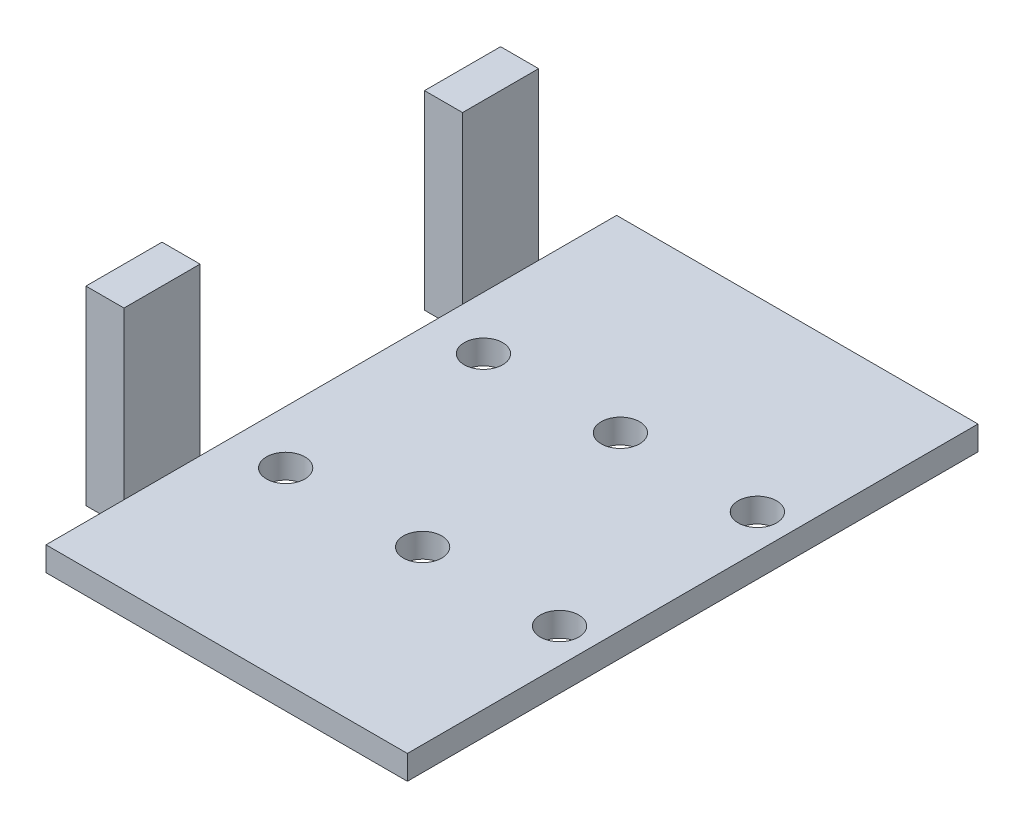
ISO-10303-21;
HEADER;
FILE_DESCRIPTION(('STEP AP214'),'2;1');
FILE_NAME('part.step','',(''),(''),'','','');
FILE_SCHEMA(('AUTOMOTIVE_DESIGN { 1 0 10303 214 1 1 1 1 }'));
ENDSEC;
DATA;
#1=APPLICATION_CONTEXT('core data for automotive mechanical design processes');
#2=APPLICATION_PROTOCOL_DEFINITION('international standard','automotive_design',2000,#1);
#3=PRODUCT_CONTEXT('',#1,'mechanical');
#4=PRODUCT('Part','Part','',(#3));
#5=PRODUCT_RELATED_PRODUCT_CATEGORY('part','',(#4));
#6=PRODUCT_DEFINITION_FORMATION('','',#4);
#7=PRODUCT_DEFINITION_CONTEXT('part definition',#1,'design');
#8=PRODUCT_DEFINITION('design','',#6,#7);
#9=PRODUCT_DEFINITION_SHAPE('','',#8);
#10=(LENGTH_UNIT() NAMED_UNIT(*) SI_UNIT(.MILLI.,.METRE.));
#11=(NAMED_UNIT(*) PLANE_ANGLE_UNIT() SI_UNIT($,.RADIAN.));
#12=(NAMED_UNIT(*) SI_UNIT($,.STERADIAN.) SOLID_ANGLE_UNIT());
#13=UNCERTAINTY_MEASURE_WITH_UNIT(LENGTH_MEASURE(1.E-05),#10,'distance_accuracy_value','');
#14=(GEOMETRIC_REPRESENTATION_CONTEXT(3) GLOBAL_UNCERTAINTY_ASSIGNED_CONTEXT((#13)) GLOBAL_UNIT_ASSIGNED_CONTEXT((#10,
#11,#12)) REPRESENTATION_CONTEXT('',''));
#15=CARTESIAN_POINT('',(0.,0.,0.));
#16=DIRECTION('',(0.,0.,1.));
#17=DIRECTION('',(1.,0.,0.));
#18=AXIS2_PLACEMENT_3D('',#15,#16,#17);
#19=CARTESIAN_POINT('',(-50.,6.35,67.7));
#20=DIRECTION('',(1.,0.,0.));
#21=DIRECTION('',(0.,0.,-1.));
#22=AXIS2_PLACEMENT_3D('',#19,#20,#21);
#23=PLANE('',#22);
#24=DIRECTION('',(0.,-1.,0.));
#25=VECTOR('',#24,1.);
#26=CARTESIAN_POINT('',(-50.,6.35,34.5));
#27=LINE('',#26,#25);
#28=CARTESIAN_POINT('',(-49.9999999999998,6.35,34.5));
#29=VERTEX_POINT('',#28);
#30=CARTESIAN_POINT('',(-50.,0.,34.5));
#31=VERTEX_POINT('',#30);
#32=EDGE_CURVE('E11',#29,#31,#27,.T.);
#33=ORIENTED_EDGE('',*,*,#32,.F.);
#34=DIRECTION('',(0.,0.,1.));
#35=VECTOR('',#34,1.);
#36=CARTESIAN_POINT('',(-50.,6.35,-75.));
#37=LINE('',#36,#35);
#38=CARTESIAN_POINT('',(-50.,6.35,-34.5));
#39=VERTEX_POINT('',#38);
#40=EDGE_CURVE('E271',#39,#29,#37,.T.);
#41=ORIENTED_EDGE('',*,*,#40,.F.);
#42=DIRECTION('',(0.,-1.,0.));
#43=VECTOR('',#42,1.);
#44=CARTESIAN_POINT('',(-50.,50.,-34.5));
#45=LINE('',#44,#43);
#46=CARTESIAN_POINT('',(-50.,0.,-34.5));
#47=VERTEX_POINT('',#46);
#48=EDGE_CURVE('E183',#39,#47,#45,.T.);
#49=ORIENTED_EDGE('',*,*,#48,.T.);
#50=DIRECTION('',(0.,0.,1.));
#51=VECTOR('',#50,1.);
#52=CARTESIAN_POINT('',(-50.,0.,67.7));
#53=LINE('',#52,#51);
#54=EDGE_CURVE('E48',#47,#31,#53,.T.);
#55=ORIENTED_EDGE('',*,*,#54,.T.);
#56=EDGE_LOOP('',(#33,#41,#49,#55));
#57=FACE_BOUND('',#56,.T.);
#58=ADVANCED_FACE('F33',(#57),#23,.F.);
#59=DIRECTION('',(0.,1.,0.));
#60=VECTOR('',#59,1.);
#61=CARTESIAN_POINT('',(-50.,6.35,54.5));
#62=LINE('',#61,#60);
#63=CARTESIAN_POINT('',(-50.,0.,54.5));
#64=VERTEX_POINT('',#63);
#65=CARTESIAN_POINT('',(-49.9999999999998,6.35,54.5));
#66=VERTEX_POINT('',#65);
#67=EDGE_CURVE('E41',#64,#66,#62,.T.);
#68=ORIENTED_EDGE('',*,*,#67,.F.);
#69=CARTESIAN_POINT('',(-50.,0.,75.));
#70=VERTEX_POINT('',#69);
#71=EDGE_CURVE('E248',#64,#70,#53,.T.);
#72=ORIENTED_EDGE('',*,*,#71,.T.);
#73=DIRECTION('',(0.,-1.,0.));
#74=VECTOR('',#73,1.);
#75=CARTESIAN_POINT('',(-50.,6.35,75.));
#76=LINE('',#75,#74);
#77=CARTESIAN_POINT('',(-50.,6.35,75.));
#78=VERTEX_POINT('',#77);
#79=EDGE_CURVE('E255',#78,#70,#76,.T.);
#80=ORIENTED_EDGE('',*,*,#79,.F.);
#81=EDGE_CURVE('E55',#66,#78,#37,.T.);
#82=ORIENTED_EDGE('',*,*,#81,.F.);
#83=EDGE_LOOP('',(#68,#72,#80,#82));
#84=FACE_BOUND('',#83,.T.);
#85=ADVANCED_FACE('F284',(#84),#23,.F.);
#86=DIRECTION('',(0.,-1.,0.));
#87=VECTOR('',#86,1.);
#88=CARTESIAN_POINT('',(-50.,50.,-54.5));
#89=LINE('',#88,#87);
#90=CARTESIAN_POINT('',(-50.,6.35,-54.5));
#91=VERTEX_POINT('',#90);
#92=CARTESIAN_POINT('',(-50.,0.,-54.5));
#93=VERTEX_POINT('',#92);
#94=EDGE_CURVE('E193',#91,#93,#89,.T.);
#95=ORIENTED_EDGE('',*,*,#94,.F.);
#96=CARTESIAN_POINT('',(-50.,6.35,-75.));
#97=VERTEX_POINT('',#96);
#98=EDGE_CURVE('E236',#97,#91,#37,.T.);
#99=ORIENTED_EDGE('',*,*,#98,.F.);
#100=DIRECTION('',(0.,-1.,0.));
#101=VECTOR('',#100,1.);
#102=CARTESIAN_POINT('',(-50.,6.35,-75.));
#103=LINE('',#102,#101);
#104=CARTESIAN_POINT('',(-50.,0.,-75.));
#105=VERTEX_POINT('',#104);
#106=EDGE_CURVE('E258',#97,#105,#103,.T.);
#107=ORIENTED_EDGE('',*,*,#106,.T.);
#108=EDGE_CURVE('E249',#105,#93,#53,.T.);
#109=ORIENTED_EDGE('',*,*,#108,.T.);
#110=EDGE_LOOP('',(#95,#99,#107,#109));
#111=FACE_BOUND('',#110,.T.);
#112=ADVANCED_FACE('F306',(#111),#23,.F.);
#113=CARTESIAN_POINT('',(0.,6.35,0.));
#114=DIRECTION('',(0.,-1.,0.));
#115=DIRECTION('',(0.,0.,-1.));
#116=AXIS2_PLACEMENT_3D('',#113,#114,#115);
#117=PLANE('',#116);
#118=DIRECTION('',(0.,0.,-1.));
#119=VECTOR('',#118,1.);
#120=CARTESIAN_POINT('',(45.,6.35,-75.));
#121=LINE('',#120,#119);
#122=CARTESIAN_POINT('',(45.,6.35,75.));
#123=VERTEX_POINT('',#122);
#124=CARTESIAN_POINT('',(45.,6.35,-75.));
#125=VERTEX_POINT('',#124);
#126=EDGE_CURVE('E230',#123,#125,#121,.T.);
#127=ORIENTED_EDGE('',*,*,#126,.T.);
#128=DIRECTION('',(-1.,0.,0.));
#129=VECTOR('',#128,1.);
#130=CARTESIAN_POINT('',(45.,6.35,-75.));
#131=LINE('',#130,#129);
#132=EDGE_CURVE('E233',#125,#97,#131,.T.);
#133=ORIENTED_EDGE('',*,*,#132,.T.);
#134=ORIENTED_EDGE('',*,*,#98,.T.);
#135=EDGE_CURVE('E240',#91,#39,#37,.T.);
#136=ORIENTED_EDGE('',*,*,#135,.T.);
#137=ORIENTED_EDGE('',*,*,#40,.T.);
#138=EDGE_CURVE('E158',#29,#66,#37,.T.);
#139=ORIENTED_EDGE('',*,*,#138,.T.);
#140=ORIENTED_EDGE('',*,*,#81,.T.);
#141=DIRECTION('',(1.,0.,0.));
#142=VECTOR('',#141,1.);
#143=CARTESIAN_POINT('',(45.,6.35,75.));
#144=LINE('',#143,#142);
#145=EDGE_CURVE('E239',#78,#123,#144,.T.);
#146=ORIENTED_EDGE('',*,*,#145,.T.);
#147=EDGE_LOOP('',(#127,#133,#134,#136,#137,#139,#140,#146));
#148=FACE_BOUND('',#147,.T.);
#149=CARTESIAN_POINT('',(-36.,6.35,-26.));
#150=DIRECTION('',(0.,1.,0.));
#151=DIRECTION('',(0.,0.,1.));
#152=AXIS2_PLACEMENT_3D('',#149,#150,#151);
#153=CIRCLE('',#152,5.05);
#154=CARTESIAN_POINT('',(-36.,6.35,-20.95));
#155=VERTEX_POINT('',#154);
#156=EDGE_CURVE('E224',#155,#155,#153,.T.);
#157=ORIENTED_EDGE('',*,*,#156,.F.);
#158=EDGE_LOOP('',(#157));
#159=FACE_BOUND('',#158,.T.);
#160=CARTESIAN_POINT('',(36.,6.35,-26.));
#161=DIRECTION('',(0.,1.,0.));
#162=DIRECTION('',(0.,0.,1.));
#163=AXIS2_PLACEMENT_3D('',#160,#161,#162);
#164=CIRCLE('',#163,5.05);
#165=CARTESIAN_POINT('',(36.,6.35,-20.95));
#166=VERTEX_POINT('',#165);
#167=EDGE_CURVE('E218',#166,#166,#164,.T.);
#168=ORIENTED_EDGE('',*,*,#167,.F.);
#169=EDGE_LOOP('',(#168));
#170=FACE_BOUND('',#169,.T.);
#171=CARTESIAN_POINT('',(36.,6.35,26.));
#172=DIRECTION('',(0.,1.,0.));
#173=DIRECTION('',(0.,0.,1.));
#174=AXIS2_PLACEMENT_3D('',#171,#172,#173);
#175=CIRCLE('',#174,5.05);
#176=CARTESIAN_POINT('',(36.,6.35,31.05));
#177=VERTEX_POINT('',#176);
#178=EDGE_CURVE('E212',#177,#177,#175,.T.);
#179=ORIENTED_EDGE('',*,*,#178,.F.);
#180=EDGE_LOOP('',(#179));
#181=FACE_BOUND('',#180,.T.);
#182=CARTESIAN_POINT('',(-36.,6.35,26.));
#183=DIRECTION('',(0.,1.,0.));
#184=DIRECTION('',(0.,0.,1.));
#185=AXIS2_PLACEMENT_3D('',#182,#183,#184);
#186=CIRCLE('',#185,5.05);
#187=CARTESIAN_POINT('',(-36.,6.35,31.05));
#188=VERTEX_POINT('',#187);
#189=EDGE_CURVE('E206',#188,#188,#186,.T.);
#190=ORIENTED_EDGE('',*,*,#189,.F.);
#191=EDGE_LOOP('',(#190));
#192=FACE_BOUND('',#191,.T.);
#193=CARTESIAN_POINT('',(0.,6.35,-26.));
#194=DIRECTION('',(0.,1.,0.));
#195=DIRECTION('',(0.,0.,1.));
#196=AXIS2_PLACEMENT_3D('',#193,#194,#195);
#197=CIRCLE('',#196,5.05);
#198=CARTESIAN_POINT('',(0.,6.35,-20.95));
#199=VERTEX_POINT('',#198);
#200=EDGE_CURVE('E200',#199,#199,#197,.T.);
#201=ORIENTED_EDGE('',*,*,#200,.F.);
#202=EDGE_LOOP('',(#201));
#203=FACE_BOUND('',#202,.T.);
#204=CARTESIAN_POINT('',(0.,6.35,26.));
#205=DIRECTION('',(0.,1.,0.));
#206=DIRECTION('',(0.,0.,1.));
#207=AXIS2_PLACEMENT_3D('',#204,#205,#206);
#208=CIRCLE('',#207,5.05);
#209=CARTESIAN_POINT('',(0.,6.35,31.05));
#210=VERTEX_POINT('',#209);
#211=EDGE_CURVE('E194',#210,#210,#208,.T.);
#212=ORIENTED_EDGE('',*,*,#211,.F.);
#213=EDGE_LOOP('',(#212));
#214=FACE_BOUND('',#213,.T.);
#215=ADVANCED_FACE('F295',(#148,#159,#170,#181,#192,#203,#214),#117,.F.);
#216=CARTESIAN_POINT('',(0.,0.,0.));
#217=DIRECTION('',(0.,-1.,0.));
#218=DIRECTION('',(0.,0.,-1.));
#219=AXIS2_PLACEMENT_3D('',#216,#217,#218);
#220=PLANE('',#219);
#221=CARTESIAN_POINT('',(0.,0.,-26.));
#222=DIRECTION('',(0.,1.,0.));
#223=DIRECTION('',(0.,0.,1.));
#224=AXIS2_PLACEMENT_3D('',#221,#222,#223);
#225=CIRCLE('',#224,5.05);
#226=CARTESIAN_POINT('',(0.,0.,-20.95));
#227=VERTEX_POINT('',#226);
#228=EDGE_CURVE('E197',#227,#227,#225,.T.);
#229=ORIENTED_EDGE('',*,*,#228,.T.);
#230=EDGE_LOOP('',(#229));
#231=FACE_BOUND('',#230,.T.);
#232=CARTESIAN_POINT('',(36.,0.,26.));
#233=DIRECTION('',(0.,1.,0.));
#234=DIRECTION('',(0.,0.,1.));
#235=AXIS2_PLACEMENT_3D('',#232,#233,#234);
#236=CIRCLE('',#235,5.05);
#237=CARTESIAN_POINT('',(36.,0.,31.05));
#238=VERTEX_POINT('',#237);
#239=EDGE_CURVE('E209',#238,#238,#236,.T.);
#240=ORIENTED_EDGE('',*,*,#239,.T.);
#241=EDGE_LOOP('',(#240));
#242=FACE_BOUND('',#241,.T.);
#243=CARTESIAN_POINT('',(-36.,0.,-26.));
#244=DIRECTION('',(0.,1.,0.));
#245=DIRECTION('',(0.,0.,1.));
#246=AXIS2_PLACEMENT_3D('',#243,#244,#245);
#247=CIRCLE('',#246,5.05);
#248=CARTESIAN_POINT('',(-36.,0.,-20.95));
#249=VERTEX_POINT('',#248);
#250=EDGE_CURVE('E221',#249,#249,#247,.T.);
#251=ORIENTED_EDGE('',*,*,#250,.T.);
#252=EDGE_LOOP('',(#251));
#253=FACE_BOUND('',#252,.T.);
#254=DIRECTION('',(0.,0.,-1.));
#255=VECTOR('',#254,1.);
#256=CARTESIAN_POINT('',(45.,0.,-75.));
#257=LINE('',#256,#255);
#258=CARTESIAN_POINT('',(45.,0.,75.));
#259=VERTEX_POINT('',#258);
#260=CARTESIAN_POINT('',(45.,0.,-75.));
#261=VERTEX_POINT('',#260);
#262=EDGE_CURVE('E227',#259,#261,#257,.T.);
#263=ORIENTED_EDGE('',*,*,#262,.F.);
#264=DIRECTION('',(1.,0.,0.));
#265=VECTOR('',#264,1.);
#266=CARTESIAN_POINT('',(45.,0.,75.));
#267=LINE('',#266,#265);
#268=EDGE_CURVE('E234',#70,#259,#267,.T.);
#269=ORIENTED_EDGE('',*,*,#268,.F.);
#270=ORIENTED_EDGE('',*,*,#71,.F.);
#271=DIRECTION('',(1.,0.,0.));
#272=VECTOR('',#271,1.);
#273=CARTESIAN_POINT('',(-50.,0.,54.5));
#274=LINE('',#273,#272);
#275=CARTESIAN_POINT('',(-59.9999999999999,0.,54.5));
#276=VERTEX_POINT('',#275);
#277=EDGE_CURVE('E154',#276,#64,#274,.T.);
#278=ORIENTED_EDGE('',*,*,#277,.F.);
#279=DIRECTION('',(0.,0.,1.));
#280=VECTOR('',#279,1.);
#281=CARTESIAN_POINT('',(-59.9999999999999,0.,54.5));
#282=LINE('',#281,#280);
#283=CARTESIAN_POINT('',(-59.9999999999999,0.,34.5));
#284=VERTEX_POINT('',#283);
#285=EDGE_CURVE('E562',#284,#276,#282,.T.);
#286=ORIENTED_EDGE('',*,*,#285,.F.);
#287=DIRECTION('',(-1.,0.,0.));
#288=VECTOR('',#287,1.);
#289=CARTESIAN_POINT('',(-50.,0.,34.5));
#290=LINE('',#289,#288);
#291=EDGE_CURVE('E283',#31,#284,#290,.T.);
#292=ORIENTED_EDGE('',*,*,#291,.F.);
#293=ORIENTED_EDGE('',*,*,#54,.F.);
#294=DIRECTION('',(1.,0.,0.));
#295=VECTOR('',#294,1.);
#296=CARTESIAN_POINT('',(-50.,0.,-34.5));
#297=LINE('',#296,#295);
#298=CARTESIAN_POINT('',(-59.9999999999999,0.,-34.5));
#299=VERTEX_POINT('',#298);
#300=EDGE_CURVE('E171',#299,#47,#297,.T.);
#301=ORIENTED_EDGE('',*,*,#300,.F.);
#302=DIRECTION('',(0.,0.,1.));
#303=VECTOR('',#302,1.);
#304=CARTESIAN_POINT('',(-60.,0.,-54.5));
#305=LINE('',#304,#303);
#306=CARTESIAN_POINT('',(-60.,0.,-54.5));
#307=VERTEX_POINT('',#306);
#308=EDGE_CURVE('E161',#307,#299,#305,.T.);
#309=ORIENTED_EDGE('',*,*,#308,.F.);
#310=DIRECTION('',(-1.,0.,0.));
#311=VECTOR('',#310,1.);
#312=CARTESIAN_POINT('',(-50.,0.,-54.5));
#313=LINE('',#312,#311);
#314=EDGE_CURVE('E159',#93,#307,#313,.T.);
#315=ORIENTED_EDGE('',*,*,#314,.F.);
#316=ORIENTED_EDGE('',*,*,#108,.F.);
#317=DIRECTION('',(-1.,0.,0.));
#318=VECTOR('',#317,1.);
#319=CARTESIAN_POINT('',(45.,0.,-75.));
#320=LINE('',#319,#318);
#321=EDGE_CURVE('E245',#261,#105,#320,.T.);
#322=ORIENTED_EDGE('',*,*,#321,.F.);
#323=EDGE_LOOP('',(#263,#269,#270,#278,#286,#292,#293,#301,#309,#315,#316,#322));
#324=FACE_BOUND('',#323,.T.);
#325=CARTESIAN_POINT('',(36.,0.,-26.));
#326=DIRECTION('',(0.,1.,0.));
#327=DIRECTION('',(0.,0.,1.));
#328=AXIS2_PLACEMENT_3D('',#325,#326,#327);
#329=CIRCLE('',#328,5.05);
#330=CARTESIAN_POINT('',(36.,0.,-20.95));
#331=VERTEX_POINT('',#330);
#332=EDGE_CURVE('E215',#331,#331,#329,.T.);
#333=ORIENTED_EDGE('',*,*,#332,.T.);
#334=EDGE_LOOP('',(#333));
#335=FACE_BOUND('',#334,.T.);
#336=CARTESIAN_POINT('',(-36.,0.,26.));
#337=DIRECTION('',(0.,1.,0.));
#338=DIRECTION('',(0.,0.,1.));
#339=AXIS2_PLACEMENT_3D('',#336,#337,#338);
#340=CIRCLE('',#339,5.05);
#341=CARTESIAN_POINT('',(-36.,0.,31.05));
#342=VERTEX_POINT('',#341);
#343=EDGE_CURVE('E203',#342,#342,#340,.T.);
#344=ORIENTED_EDGE('',*,*,#343,.T.);
#345=EDGE_LOOP('',(#344));
#346=FACE_BOUND('',#345,.T.);
#347=CARTESIAN_POINT('',(0.,0.,26.));
#348=DIRECTION('',(0.,1.,0.));
#349=DIRECTION('',(0.,0.,1.));
#350=AXIS2_PLACEMENT_3D('',#347,#348,#349);
#351=CIRCLE('',#350,5.05);
#352=CARTESIAN_POINT('',(0.,0.,31.05));
#353=VERTEX_POINT('',#352);
#354=EDGE_CURVE('E192',#353,#353,#351,.T.);
#355=ORIENTED_EDGE('',*,*,#354,.T.);
#356=EDGE_LOOP('',(#355));
#357=FACE_BOUND('',#356,.T.);
#358=ADVANCED_FACE('F279',(#231,#242,#253,#324,#335,#346,#357),#220,.T.);
#359=CARTESIAN_POINT('',(45.,6.35,-75.));
#360=DIRECTION('',(-1.,0.,0.));
#361=DIRECTION('',(0.,0.,1.));
#362=AXIS2_PLACEMENT_3D('',#359,#360,#361);
#363=PLANE('',#362);
#364=ORIENTED_EDGE('',*,*,#262,.T.);
#365=DIRECTION('',(0.,-1.,0.));
#366=VECTOR('',#365,1.);
#367=CARTESIAN_POINT('',(45.,6.35,-75.));
#368=LINE('',#367,#366);
#369=EDGE_CURVE('E261',#125,#261,#368,.T.);
#370=ORIENTED_EDGE('',*,*,#369,.F.);
#371=ORIENTED_EDGE('',*,*,#126,.F.);
#372=DIRECTION('',(0.,-1.,0.));
#373=VECTOR('',#372,1.);
#374=CARTESIAN_POINT('',(45.,6.35,75.));
#375=LINE('',#374,#373);
#376=EDGE_CURVE('E242',#123,#259,#375,.T.);
#377=ORIENTED_EDGE('',*,*,#376,.T.);
#378=EDGE_LOOP('',(#364,#370,#371,#377));
#379=FACE_BOUND('',#378,.T.);
#380=ADVANCED_FACE('F35',(#379),#363,.F.);
#381=CARTESIAN_POINT('',(45.,6.35,-75.));
#382=DIRECTION('',(0.,0.,1.));
#383=DIRECTION('',(1.,0.,0.));
#384=AXIS2_PLACEMENT_3D('',#381,#382,#383);
#385=PLANE('',#384);
#386=ORIENTED_EDGE('',*,*,#321,.T.);
#387=ORIENTED_EDGE('',*,*,#106,.F.);
#388=ORIENTED_EDGE('',*,*,#132,.F.);
#389=ORIENTED_EDGE('',*,*,#369,.T.);
#390=EDGE_LOOP('',(#386,#387,#388,#389));
#391=FACE_BOUND('',#390,.T.);
#392=ADVANCED_FACE('F308',(#391),#385,.F.);
#393=CARTESIAN_POINT('',(45.,6.35,75.));
#394=DIRECTION('',(0.,0.,-1.));
#395=DIRECTION('',(-1.,0.,0.));
#396=AXIS2_PLACEMENT_3D('',#393,#394,#395);
#397=PLANE('',#396);
#398=ORIENTED_EDGE('',*,*,#268,.T.);
#399=ORIENTED_EDGE('',*,*,#376,.F.);
#400=ORIENTED_EDGE('',*,*,#145,.F.);
#401=ORIENTED_EDGE('',*,*,#79,.T.);
#402=EDGE_LOOP('',(#398,#399,#400,#401));
#403=FACE_BOUND('',#402,.T.);
#404=ADVANCED_FACE('F289',(#403),#397,.F.);
#405=CARTESIAN_POINT('',(-36.,6.35,-26.));
#406=DIRECTION('',(0.,-1.,0.));
#407=DIRECTION('',(0.,0.,-1.));
#408=AXIS2_PLACEMENT_3D('',#405,#406,#407);
#409=CYLINDRICAL_SURFACE('',#408,5.05);
#410=ORIENTED_EDGE('',*,*,#156,.T.);
#411=EDGE_LOOP('',(#410));
#412=FACE_BOUND('',#411,.T.);
#413=ORIENTED_EDGE('',*,*,#250,.F.);
#414=EDGE_LOOP('',(#413));
#415=FACE_BOUND('',#414,.T.);
#416=ADVANCED_FACE('F314',(#412,#415),#409,.F.);
#417=CARTESIAN_POINT('',(36.,6.35,-26.));
#418=DIRECTION('',(0.,-1.,0.));
#419=DIRECTION('',(0.,0.,-1.));
#420=AXIS2_PLACEMENT_3D('',#417,#418,#419);
#421=CYLINDRICAL_SURFACE('',#420,5.05);
#422=ORIENTED_EDGE('',*,*,#167,.T.);
#423=EDGE_LOOP('',(#422));
#424=FACE_BOUND('',#423,.T.);
#425=ORIENTED_EDGE('',*,*,#332,.F.);
#426=EDGE_LOOP('',(#425));
#427=FACE_BOUND('',#426,.T.);
#428=ADVANCED_FACE('F334',(#424,#427),#421,.F.);
#429=CARTESIAN_POINT('',(36.,6.35,26.));
#430=DIRECTION('',(0.,-1.,0.));
#431=DIRECTION('',(0.,0.,-1.));
#432=AXIS2_PLACEMENT_3D('',#429,#430,#431);
#433=CYLINDRICAL_SURFACE('',#432,5.05);
#434=ORIENTED_EDGE('',*,*,#178,.T.);
#435=EDGE_LOOP('',(#434));
#436=FACE_BOUND('',#435,.T.);
#437=ORIENTED_EDGE('',*,*,#239,.F.);
#438=EDGE_LOOP('',(#437));
#439=FACE_BOUND('',#438,.T.);
#440=ADVANCED_FACE('F338',(#436,#439),#433,.F.);
#441=CARTESIAN_POINT('',(-36.,6.35,26.));
#442=DIRECTION('',(0.,-1.,0.));
#443=DIRECTION('',(0.,0.,-1.));
#444=AXIS2_PLACEMENT_3D('',#441,#442,#443);
#445=CYLINDRICAL_SURFACE('',#444,5.05);
#446=ORIENTED_EDGE('',*,*,#189,.T.);
#447=EDGE_LOOP('',(#446));
#448=FACE_BOUND('',#447,.T.);
#449=ORIENTED_EDGE('',*,*,#343,.F.);
#450=EDGE_LOOP('',(#449));
#451=FACE_BOUND('',#450,.T.);
#452=ADVANCED_FACE('F342',(#448,#451),#445,.F.);
#453=CARTESIAN_POINT('',(0.,6.35,-26.));
#454=DIRECTION('',(0.,-1.,0.));
#455=DIRECTION('',(0.,0.,-1.));
#456=AXIS2_PLACEMENT_3D('',#453,#454,#455);
#457=CYLINDRICAL_SURFACE('',#456,5.05);
#458=ORIENTED_EDGE('',*,*,#200,.T.);
#459=EDGE_LOOP('',(#458));
#460=FACE_BOUND('',#459,.T.);
#461=ORIENTED_EDGE('',*,*,#228,.F.);
#462=EDGE_LOOP('',(#461));
#463=FACE_BOUND('',#462,.T.);
#464=ADVANCED_FACE('F346',(#460,#463),#457,.F.);
#465=CARTESIAN_POINT('',(0.,6.35,26.));
#466=DIRECTION('',(0.,-1.,0.));
#467=DIRECTION('',(0.,0.,-1.));
#468=AXIS2_PLACEMENT_3D('',#465,#466,#467);
#469=CYLINDRICAL_SURFACE('',#468,5.05);
#470=ORIENTED_EDGE('',*,*,#211,.T.);
#471=EDGE_LOOP('',(#470));
#472=FACE_BOUND('',#471,.T.);
#473=ORIENTED_EDGE('',*,*,#354,.F.);
#474=EDGE_LOOP('',(#473));
#475=FACE_BOUND('',#474,.T.);
#476=ADVANCED_FACE('F350',(#472,#475),#469,.F.);
#477=CARTESIAN_POINT('',(-50.,50.,-54.5));
#478=DIRECTION('',(-1.,0.,0.));
#479=DIRECTION('',(0.,0.,1.));
#480=AXIS2_PLACEMENT_3D('',#477,#478,#479);
#481=PLANE('',#480);
#482=ORIENTED_EDGE('',*,*,#135,.F.);
#483=CARTESIAN_POINT('',(-50.,50.,-54.5));
#484=VERTEX_POINT('',#483);
#485=EDGE_CURVE('E189',#484,#91,#89,.T.);
#486=ORIENTED_EDGE('',*,*,#485,.F.);
#487=DIRECTION('',(0.,0.,-1.));
#488=VECTOR('',#487,1.);
#489=CARTESIAN_POINT('',(-50.,50.,-54.5));
#490=LINE('',#489,#488);
#491=CARTESIAN_POINT('',(-50.,50.,-34.5));
#492=VERTEX_POINT('',#491);
#493=EDGE_CURVE('E167',#492,#484,#490,.T.);
#494=ORIENTED_EDGE('',*,*,#493,.F.);
#495=EDGE_CURVE('E176',#492,#39,#45,.T.);
#496=ORIENTED_EDGE('',*,*,#495,.T.);
#497=EDGE_LOOP('',(#482,#486,#494,#496));
#498=FACE_BOUND('',#497,.T.);
#499=ADVANCED_FACE('F301',(#498),#481,.F.);
#500=CARTESIAN_POINT('',(-50.,50.,-54.5));
#501=DIRECTION('',(0.,0.,1.));
#502=DIRECTION('',(1.,0.,0.));
#503=AXIS2_PLACEMENT_3D('',#500,#501,#502);
#504=PLANE('',#503);
#505=ORIENTED_EDGE('',*,*,#314,.T.);
#506=DIRECTION('',(0.,-1.,0.));
#507=VECTOR('',#506,1.);
#508=CARTESIAN_POINT('',(-60.,50.,-54.5));
#509=LINE('',#508,#507);
#510=CARTESIAN_POINT('',(-60.,50.,-54.5));
#511=VERTEX_POINT('',#510);
#512=EDGE_CURVE('E186',#511,#307,#509,.T.);
#513=ORIENTED_EDGE('',*,*,#512,.F.);
#514=DIRECTION('',(-1.,0.,0.));
#515=VECTOR('',#514,1.);
#516=CARTESIAN_POINT('',(-50.,50.,-54.5));
#517=LINE('',#516,#515);
#518=EDGE_CURVE('E170',#484,#511,#517,.T.);
#519=ORIENTED_EDGE('',*,*,#518,.F.);
#520=ORIENTED_EDGE('',*,*,#485,.T.);
#521=ORIENTED_EDGE('',*,*,#94,.T.);
#522=EDGE_LOOP('',(#505,#513,#519,#520,#521));
#523=FACE_BOUND('',#522,.T.);
#524=ADVANCED_FACE('F303',(#523),#504,.F.);
#525=CARTESIAN_POINT('',(-60.,50.,-54.5));
#526=DIRECTION('',(1.,0.,0.));
#527=DIRECTION('',(0.,0.,-1.));
#528=AXIS2_PLACEMENT_3D('',#525,#526,#527);
#529=PLANE('',#528);
#530=ORIENTED_EDGE('',*,*,#308,.T.);
#531=DIRECTION('',(0.,-1.,0.));
#532=VECTOR('',#531,1.);
#533=CARTESIAN_POINT('',(-59.9999999999999,50.,-34.5));
#534=LINE('',#533,#532);
#535=CARTESIAN_POINT('',(-59.9999999999999,50.,-34.5));
#536=VERTEX_POINT('',#535);
#537=EDGE_CURVE('E182',#536,#299,#534,.T.);
#538=ORIENTED_EDGE('',*,*,#537,.F.);
#539=DIRECTION('',(0.,0.,1.));
#540=VECTOR('',#539,1.);
#541=CARTESIAN_POINT('',(-60.,50.,-54.5));
#542=LINE('',#541,#540);
#543=EDGE_CURVE('E173',#511,#536,#542,.T.);
#544=ORIENTED_EDGE('',*,*,#543,.F.);
#545=ORIENTED_EDGE('',*,*,#512,.T.);
#546=EDGE_LOOP('',(#530,#538,#544,#545));
#547=FACE_BOUND('',#546,.T.);
#548=ADVANCED_FACE('F359',(#547),#529,.F.);
#549=CARTESIAN_POINT('',(-50.,50.,-34.5));
#550=DIRECTION('',(0.,0.,-1.));
#551=DIRECTION('',(-1.,0.,0.));
#552=AXIS2_PLACEMENT_3D('',#549,#550,#551);
#553=PLANE('',#552);
#554=ORIENTED_EDGE('',*,*,#300,.T.);
#555=ORIENTED_EDGE('',*,*,#48,.F.);
#556=ORIENTED_EDGE('',*,*,#495,.F.);
#557=DIRECTION('',(1.,0.,0.));
#558=VECTOR('',#557,1.);
#559=CARTESIAN_POINT('',(-50.,50.,-34.5));
#560=LINE('',#559,#558);
#561=EDGE_CURVE('E175',#536,#492,#560,.T.);
#562=ORIENTED_EDGE('',*,*,#561,.F.);
#563=ORIENTED_EDGE('',*,*,#537,.T.);
#564=EDGE_LOOP('',(#554,#555,#556,#562,#563));
#565=FACE_BOUND('',#564,.T.);
#566=ADVANCED_FACE('F362',(#565),#553,.F.);
#567=CARTESIAN_POINT('',(0.,50.,0.));
#568=DIRECTION('',(0.,-1.,0.));
#569=DIRECTION('',(0.,0.,-1.));
#570=AXIS2_PLACEMENT_3D('',#567,#568,#569);
#571=PLANE('',#570);
#572=ORIENTED_EDGE('',*,*,#493,.T.);
#573=ORIENTED_EDGE('',*,*,#518,.T.);
#574=ORIENTED_EDGE('',*,*,#543,.T.);
#575=ORIENTED_EDGE('',*,*,#561,.T.);
#576=EDGE_LOOP('',(#572,#573,#574,#575));
#577=FACE_BOUND('',#576,.T.);
#578=ADVANCED_FACE('F366',(#577),#571,.F.);
#579=CARTESIAN_POINT('',(-50.,50.,54.5));
#580=DIRECTION('',(-1.,0.,0.));
#581=DIRECTION('',(0.,0.,1.));
#582=AXIS2_PLACEMENT_3D('',#579,#580,#581);
#583=PLANE('',#582);
#584=DIRECTION('',(0.,-1.,0.));
#585=VECTOR('',#584,1.);
#586=CARTESIAN_POINT('',(-50.,50.,54.5));
#587=LINE('',#586,#585);
#588=CARTESIAN_POINT('',(-50.,50.,54.5));
#589=VERTEX_POINT('',#588);
#590=EDGE_CURVE('E567',#589,#66,#587,.T.);
#591=ORIENTED_EDGE('',*,*,#590,.T.);
#592=ORIENTED_EDGE('',*,*,#138,.F.);
#593=DIRECTION('',(0.,-1.,0.));
#594=VECTOR('',#593,1.);
#595=CARTESIAN_POINT('',(-50.,50.,34.5));
#596=LINE('',#595,#594);
#597=CARTESIAN_POINT('',(-50.,50.,34.5));
#598=VERTEX_POINT('',#597);
#599=EDGE_CURVE('E139',#598,#29,#596,.T.);
#600=ORIENTED_EDGE('',*,*,#599,.F.);
#601=DIRECTION('',(0.,0.,-1.));
#602=VECTOR('',#601,1.);
#603=CARTESIAN_POINT('',(-50.,50.,54.5));
#604=LINE('',#603,#602);
#605=EDGE_CURVE('E145',#589,#598,#604,.T.);
#606=ORIENTED_EDGE('',*,*,#605,.F.);
#607=EDGE_LOOP('',(#591,#592,#600,#606));
#608=FACE_BOUND('',#607,.T.);
#609=ADVANCED_FACE('F157',(#608),#583,.F.);
#610=CARTESIAN_POINT('',(-50.,50.,34.5));
#611=DIRECTION('',(0.,0.,1.));
#612=DIRECTION('',(1.,0.,0.));
#613=AXIS2_PLACEMENT_3D('',#610,#611,#612);
#614=PLANE('',#613);
#615=ORIENTED_EDGE('',*,*,#291,.T.);
#616=DIRECTION('',(0.,-1.,0.));
#617=VECTOR('',#616,1.);
#618=CARTESIAN_POINT('',(-59.9999999999999,50.,34.5));
#619=LINE('',#618,#617);
#620=CARTESIAN_POINT('',(-59.9999999999999,50.,34.5));
#621=VERTEX_POINT('',#620);
#622=EDGE_CURVE('E141',#621,#284,#619,.T.);
#623=ORIENTED_EDGE('',*,*,#622,.F.);
#624=DIRECTION('',(-1.,0.,0.));
#625=VECTOR('',#624,1.);
#626=CARTESIAN_POINT('',(-50.,50.,34.5));
#627=LINE('',#626,#625);
#628=EDGE_CURVE('E135',#598,#621,#627,.T.);
#629=ORIENTED_EDGE('',*,*,#628,.F.);
#630=ORIENTED_EDGE('',*,*,#599,.T.);
#631=ORIENTED_EDGE('',*,*,#32,.T.);
#632=EDGE_LOOP('',(#615,#623,#629,#630,#631));
#633=FACE_BOUND('',#632,.T.);
#634=ADVANCED_FACE('F137',(#633),#614,.F.);
#635=CARTESIAN_POINT('',(-59.9999999999999,50.,54.5));
#636=DIRECTION('',(1.,0.,0.));
#637=DIRECTION('',(0.,0.,-1.));
#638=AXIS2_PLACEMENT_3D('',#635,#636,#637);
#639=PLANE('',#638);
#640=ORIENTED_EDGE('',*,*,#285,.T.);
#641=DIRECTION('',(0.,-1.,0.));
#642=VECTOR('',#641,1.);
#643=CARTESIAN_POINT('',(-59.9999999999999,50.,54.5));
#644=LINE('',#643,#642);
#645=CARTESIAN_POINT('',(-59.9999999999999,50.,54.5));
#646=VERTEX_POINT('',#645);
#647=EDGE_CURVE('E163',#646,#276,#644,.T.);
#648=ORIENTED_EDGE('',*,*,#647,.F.);
#649=DIRECTION('',(0.,0.,1.));
#650=VECTOR('',#649,1.);
#651=CARTESIAN_POINT('',(-59.9999999999999,50.,54.5));
#652=LINE('',#651,#650);
#653=EDGE_CURVE('E144',#621,#646,#652,.T.);
#654=ORIENTED_EDGE('',*,*,#653,.F.);
#655=ORIENTED_EDGE('',*,*,#622,.T.);
#656=EDGE_LOOP('',(#640,#648,#654,#655));
#657=FACE_BOUND('',#656,.T.);
#658=ADVANCED_FACE('F374',(#657),#639,.F.);
#659=CARTESIAN_POINT('',(-50.,50.,54.5));
#660=DIRECTION('',(0.,0.,-1.));
#661=DIRECTION('',(-1.,0.,0.));
#662=AXIS2_PLACEMENT_3D('',#659,#660,#661);
#663=PLANE('',#662);
#664=ORIENTED_EDGE('',*,*,#277,.T.);
#665=ORIENTED_EDGE('',*,*,#67,.T.);
#666=ORIENTED_EDGE('',*,*,#590,.F.);
#667=DIRECTION('',(1.,0.,0.));
#668=VECTOR('',#667,1.);
#669=CARTESIAN_POINT('',(-50.,50.,54.5));
#670=LINE('',#669,#668);
#671=EDGE_CURVE('E150',#646,#589,#670,.T.);
#672=ORIENTED_EDGE('',*,*,#671,.F.);
#673=ORIENTED_EDGE('',*,*,#647,.T.);
#674=EDGE_LOOP('',(#664,#665,#666,#672,#673));
#675=FACE_BOUND('',#674,.T.);
#676=ADVANCED_FACE('F377',(#675),#663,.F.);
#677=CARTESIAN_POINT('',(0.,50.,0.));
#678=DIRECTION('',(0.,1.,0.));
#679=DIRECTION('',(0.,0.,1.));
#680=AXIS2_PLACEMENT_3D('',#677,#678,#679);
#681=PLANE('',#680);
#682=ORIENTED_EDGE('',*,*,#605,.T.);
#683=ORIENTED_EDGE('',*,*,#628,.T.);
#684=ORIENTED_EDGE('',*,*,#653,.T.);
#685=ORIENTED_EDGE('',*,*,#671,.T.);
#686=EDGE_LOOP('',(#682,#683,#684,#685));
#687=FACE_BOUND('',#686,.T.);
#688=ADVANCED_FACE('F148',(#687),#681,.T.);
#689=CLOSED_SHELL('',(#58,#85,#112,#215,#358,#380,#392,#404,#416,#428,#440,#452,#464,#476,#499,
#524,#548,#566,#578,#609,#634,#658,#676,#688));
#690=MANIFOLD_SOLID_BREP('B2',#689);
#691=ADVANCED_BREP_SHAPE_REPRESENTATION('',(#18,#690),#14);
#692=SHAPE_DEFINITION_REPRESENTATION(#9,#691);
ENDSEC;
END-ISO-10303-21;
